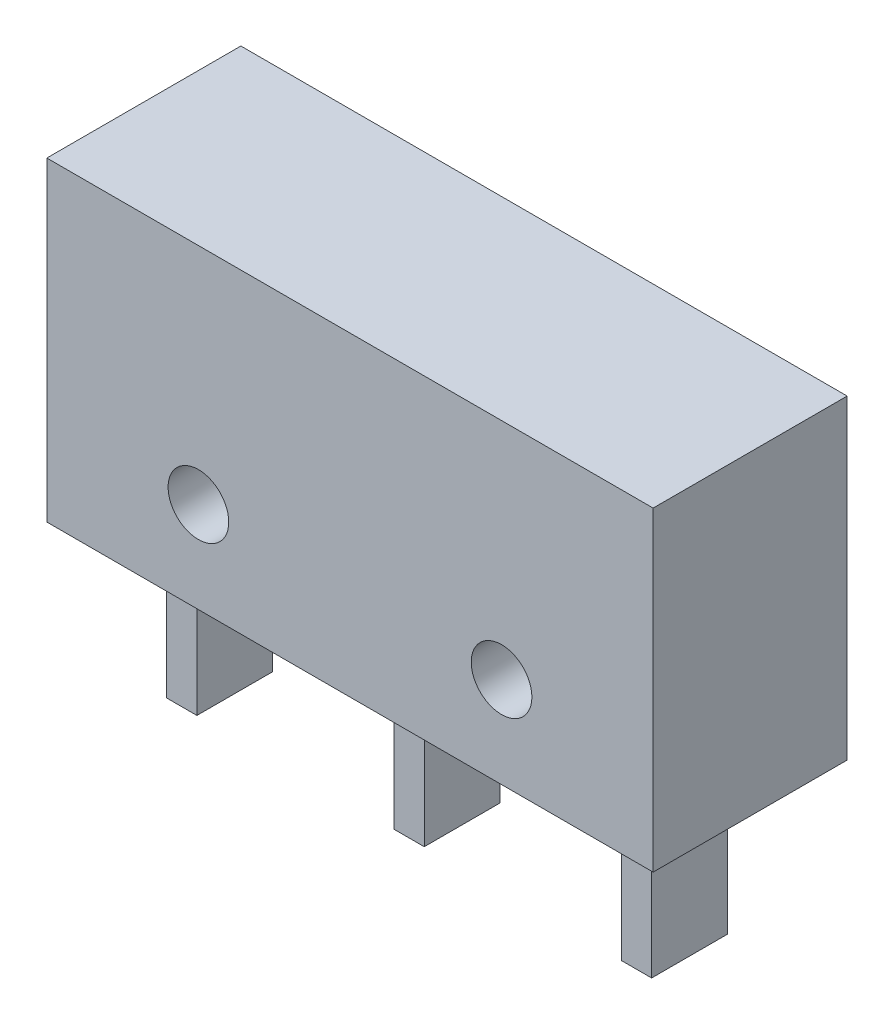
ISO-10303-21;
HEADER;
FILE_DESCRIPTION(('STEP AP214'),'2;1');
FILE_NAME('part.step','',(''),(''),'','','');
FILE_SCHEMA(('AUTOMOTIVE_DESIGN { 1 0 10303 214 1 1 1 1 }'));
ENDSEC;
DATA;
#1=APPLICATION_CONTEXT('core data for automotive mechanical design processes');
#2=APPLICATION_PROTOCOL_DEFINITION('international standard','automotive_design',2000,#1);
#3=PRODUCT_CONTEXT('',#1,'mechanical');
#4=PRODUCT('Part','Part','',(#3));
#5=PRODUCT_RELATED_PRODUCT_CATEGORY('part','',(#4));
#6=PRODUCT_DEFINITION_FORMATION('','',#4);
#7=PRODUCT_DEFINITION_CONTEXT('part definition',#1,'design');
#8=PRODUCT_DEFINITION('design','',#6,#7);
#9=PRODUCT_DEFINITION_SHAPE('','',#8);
#10=(LENGTH_UNIT() NAMED_UNIT(*) SI_UNIT(.MILLI.,.METRE.));
#11=(NAMED_UNIT(*) PLANE_ANGLE_UNIT() SI_UNIT($,.RADIAN.));
#12=(NAMED_UNIT(*) SI_UNIT($,.STERADIAN.) SOLID_ANGLE_UNIT());
#13=UNCERTAINTY_MEASURE_WITH_UNIT(LENGTH_MEASURE(1.E-05),#10,'distance_accuracy_value','');
#14=(GEOMETRIC_REPRESENTATION_CONTEXT(3) GLOBAL_UNCERTAINTY_ASSIGNED_CONTEXT((#13)) GLOBAL_UNIT_ASSIGNED_CONTEXT((#10,
#11,#12)) REPRESENTATION_CONTEXT('',''));
#15=CARTESIAN_POINT('',(0.,0.,0.));
#16=DIRECTION('',(0.,0.,1.));
#17=DIRECTION('',(1.,0.,0.));
#18=AXIS2_PLACEMENT_3D('',#15,#16,#17);
#19=CARTESIAN_POINT('',(-10.,-5.2,6.4));
#20=DIRECTION('',(0.,1.,0.));
#21=DIRECTION('',(0.,0.,1.));
#22=AXIS2_PLACEMENT_3D('',#19,#20,#21);
#23=PLANE('',#22);
#24=DIRECTION('',(0.,0.,1.));
#25=VECTOR('',#24,1.);
#26=CARTESIAN_POINT('',(0.499999999999996,-5.2,4.45));
#27=LINE('',#26,#25);
#28=CARTESIAN_POINT('',(0.499999999999996,-5.2,1.95));
#29=VERTEX_POINT('',#28);
#30=CARTESIAN_POINT('',(0.499999999999997,-5.2,4.45));
#31=VERTEX_POINT('',#30);
#32=EDGE_CURVE('E167',#29,#31,#27,.T.);
#33=ORIENTED_EDGE('',*,*,#32,.F.);
#34=DIRECTION('',(1.,0.,0.));
#35=VECTOR('',#34,1.);
#36=CARTESIAN_POINT('',(-0.500000000000004,-5.2,1.95));
#37=LINE('',#36,#35);
#38=CARTESIAN_POINT('',(-0.500000000000004,-5.2,1.95));
#39=VERTEX_POINT('',#38);
#40=EDGE_CURVE('E180',#39,#29,#37,.T.);
#41=ORIENTED_EDGE('',*,*,#40,.F.);
#42=DIRECTION('',(0.,0.,-1.));
#43=VECTOR('',#42,1.);
#44=CARTESIAN_POINT('',(-0.500000000000004,-5.2,4.45));
#45=LINE('',#44,#43);
#46=CARTESIAN_POINT('',(-0.500000000000004,-5.2,4.45));
#47=VERTEX_POINT('',#46);
#48=EDGE_CURVE('E189',#47,#39,#45,.T.);
#49=ORIENTED_EDGE('',*,*,#48,.F.);
#50=DIRECTION('',(-1.,0.,0.));
#51=VECTOR('',#50,1.);
#52=CARTESIAN_POINT('',(-0.500000000000004,-5.2,4.45));
#53=LINE('',#52,#51);
#54=EDGE_CURVE('E170',#31,#47,#53,.T.);
#55=ORIENTED_EDGE('',*,*,#54,.F.);
#56=EDGE_LOOP('',(#33,#41,#49,#55));
#57=FACE_BOUND('',#56,.T.);
#58=DIRECTION('',(1.,0.,0.));
#59=VECTOR('',#58,1.);
#60=CARTESIAN_POINT('',(-10.,-5.2,0.));
#61=LINE('',#60,#59);
#62=CARTESIAN_POINT('',(-10.,-5.2,0.));
#63=VERTEX_POINT('',#62);
#64=CARTESIAN_POINT('',(10.,-5.2,0.));
#65=VERTEX_POINT('',#64);
#66=EDGE_CURVE('E255',#63,#65,#61,.T.);
#67=ORIENTED_EDGE('',*,*,#66,.T.);
#68=DIRECTION('',(0.,0.,-1.));
#69=VECTOR('',#68,1.);
#70=CARTESIAN_POINT('',(10.,-5.2,6.4));
#71=LINE('',#70,#69);
#72=CARTESIAN_POINT('',(10.,-5.2,6.4));
#73=VERTEX_POINT('',#72);
#74=EDGE_CURVE('E261',#73,#65,#71,.T.);
#75=ORIENTED_EDGE('',*,*,#74,.F.);
#76=DIRECTION('',(1.,0.,0.));
#77=VECTOR('',#76,1.);
#78=CARTESIAN_POINT('',(-10.,-5.2,6.4));
#79=LINE('',#78,#77);
#80=CARTESIAN_POINT('',(-10.,-5.2,6.4));
#81=VERTEX_POINT('',#80);
#82=EDGE_CURVE('E259',#81,#73,#79,.T.);
#83=ORIENTED_EDGE('',*,*,#82,.F.);
#84=DIRECTION('',(0.,0.,-1.));
#85=VECTOR('',#84,1.);
#86=CARTESIAN_POINT('',(-10.,-5.2,6.4));
#87=LINE('',#86,#85);
#88=EDGE_CURVE('E271',#81,#63,#87,.T.);
#89=ORIENTED_EDGE('',*,*,#88,.T.);
#90=EDGE_LOOP('',(#67,#75,#83,#89));
#91=FACE_BOUND('',#90,.T.);
#92=DIRECTION('',(0.,0.,1.));
#93=VECTOR('',#92,1.);
#94=CARTESIAN_POINT('',(-7.,-5.2,4.45));
#95=LINE('',#94,#93);
#96=CARTESIAN_POINT('',(-7.,-5.2,1.95));
#97=VERTEX_POINT('',#96);
#98=CARTESIAN_POINT('',(-7.,-5.2,4.45));
#99=VERTEX_POINT('',#98);
#100=EDGE_CURVE('E205',#97,#99,#95,.T.);
#101=ORIENTED_EDGE('',*,*,#100,.F.);
#102=DIRECTION('',(1.,0.,0.));
#103=VECTOR('',#102,1.);
#104=CARTESIAN_POINT('',(-8.00000000000001,-5.2,1.95));
#105=LINE('',#104,#103);
#106=CARTESIAN_POINT('',(-8.00000000000001,-5.2,1.95));
#107=VERTEX_POINT('',#106);
#108=EDGE_CURVE('E210',#107,#97,#105,.T.);
#109=ORIENTED_EDGE('',*,*,#108,.F.);
#110=DIRECTION('',(0.,0.,-1.));
#111=VECTOR('',#110,1.);
#112=CARTESIAN_POINT('',(-8.00000000000001,-5.2,4.45));
#113=LINE('',#112,#111);
#114=CARTESIAN_POINT('',(-8.00000000000001,-5.2,4.45));
#115=VERTEX_POINT('',#114);
#116=EDGE_CURVE('E222',#115,#107,#113,.T.);
#117=ORIENTED_EDGE('',*,*,#116,.F.);
#118=DIRECTION('',(-1.,0.,0.));
#119=VECTOR('',#118,1.);
#120=CARTESIAN_POINT('',(-8.00000000000001,-5.2,4.45));
#121=LINE('',#120,#119);
#122=EDGE_CURVE('E219',#99,#115,#121,.T.);
#123=ORIENTED_EDGE('',*,*,#122,.F.);
#124=EDGE_LOOP('',(#101,#109,#117,#123));
#125=FACE_BOUND('',#124,.T.);
#126=DIRECTION('',(0.,0.,1.));
#127=VECTOR('',#126,1.);
#128=CARTESIAN_POINT('',(8.,-5.2,4.45));
#129=LINE('',#128,#127);
#130=CARTESIAN_POINT('',(8.,-5.2,1.95));
#131=VERTEX_POINT('',#130);
#132=CARTESIAN_POINT('',(8.,-5.2,4.45));
#133=VERTEX_POINT('',#132);
#134=EDGE_CURVE('E166',#131,#133,#129,.T.);
#135=ORIENTED_EDGE('',*,*,#134,.F.);
#136=DIRECTION('',(1.,0.,0.));
#137=VECTOR('',#136,1.);
#138=CARTESIAN_POINT('',(7.,-5.2,1.95));
#139=LINE('',#138,#137);
#140=CARTESIAN_POINT('',(7.,-5.2,1.95));
#141=VERTEX_POINT('',#140);
#142=EDGE_CURVE('E163',#141,#131,#139,.T.);
#143=ORIENTED_EDGE('',*,*,#142,.F.);
#144=DIRECTION('',(0.,0.,-1.));
#145=VECTOR('',#144,1.);
#146=CARTESIAN_POINT('',(7.,-5.2,4.45));
#147=LINE('',#146,#145);
#148=CARTESIAN_POINT('',(7.,-5.2,4.45));
#149=VERTEX_POINT('',#148);
#150=EDGE_CURVE('E53',#149,#141,#147,.T.);
#151=ORIENTED_EDGE('',*,*,#150,.F.);
#152=DIRECTION('',(-1.,0.,0.));
#153=VECTOR('',#152,1.);
#154=CARTESIAN_POINT('',(7.,-5.2,4.45));
#155=LINE('',#154,#153);
#156=EDGE_CURVE('E48',#133,#149,#155,.T.);
#157=ORIENTED_EDGE('',*,*,#156,.F.);
#158=EDGE_LOOP('',(#135,#143,#151,#157));
#159=FACE_BOUND('',#158,.T.);
#160=ADVANCED_FACE('F33',(#57,#91,#125,#159),#23,.F.);
#161=CARTESIAN_POINT('',(0.,0.,6.4));
#162=DIRECTION('',(0.,0.,-1.));
#163=DIRECTION('',(-1.,0.,0.));
#164=AXIS2_PLACEMENT_3D('',#161,#162,#163);
#165=PLANE('',#164);
#166=CARTESIAN_POINT('',(-5.,-2.2,6.4));
#167=DIRECTION('',(0.,0.,1.));
#168=DIRECTION('',(1.,0.,0.));
#169=AXIS2_PLACEMENT_3D('',#166,#167,#168);
#170=CIRCLE('',#169,1.);
#171=CARTESIAN_POINT('',(-4.,-2.2,6.4));
#172=VERTEX_POINT('',#171);
#173=EDGE_CURVE('E245',#172,#172,#170,.T.);
#174=ORIENTED_EDGE('',*,*,#173,.F.);
#175=EDGE_LOOP('',(#174));
#176=FACE_BOUND('',#175,.T.);
#177=DIRECTION('',(0.,1.,0.));
#178=VECTOR('',#177,1.);
#179=CARTESIAN_POINT('',(10.,-5.2,6.4));
#180=LINE('',#179,#178);
#181=CARTESIAN_POINT('',(10.,5.2,6.4));
#182=VERTEX_POINT('',#181);
#183=EDGE_CURVE('E251',#73,#182,#180,.T.);
#184=ORIENTED_EDGE('',*,*,#183,.T.);
#185=DIRECTION('',(-1.,0.,0.));
#186=VECTOR('',#185,1.);
#187=CARTESIAN_POINT('',(-10.,5.2,6.4));
#188=LINE('',#187,#186);
#189=CARTESIAN_POINT('',(-10.,5.2,6.4));
#190=VERTEX_POINT('',#189);
#191=EDGE_CURVE('E254',#182,#190,#188,.T.);
#192=ORIENTED_EDGE('',*,*,#191,.T.);
#193=DIRECTION('',(0.,-1.,0.));
#194=VECTOR('',#193,1.);
#195=CARTESIAN_POINT('',(-10.,-5.2,6.4));
#196=LINE('',#195,#194);
#197=EDGE_CURVE('E257',#190,#81,#196,.T.);
#198=ORIENTED_EDGE('',*,*,#197,.T.);
#199=ORIENTED_EDGE('',*,*,#82,.T.);
#200=EDGE_LOOP('',(#184,#192,#198,#199));
#201=FACE_BOUND('',#200,.T.);
#202=CARTESIAN_POINT('',(5.,-2.2,6.4));
#203=DIRECTION('',(0.,0.,1.));
#204=DIRECTION('',(1.,0.,0.));
#205=AXIS2_PLACEMENT_3D('',#202,#203,#204);
#206=CIRCLE('',#205,1.);
#207=CARTESIAN_POINT('',(6.,-2.2,6.4));
#208=VERTEX_POINT('',#207);
#209=EDGE_CURVE('E239',#208,#208,#206,.T.);
#210=ORIENTED_EDGE('',*,*,#209,.F.);
#211=EDGE_LOOP('',(#210));
#212=FACE_BOUND('',#211,.T.);
#213=ADVANCED_FACE('F294',(#176,#201,#212),#165,.F.);
#214=CARTESIAN_POINT('',(0.,0.,0.));
#215=DIRECTION('',(0.,0.,-1.));
#216=DIRECTION('',(-1.,0.,0.));
#217=AXIS2_PLACEMENT_3D('',#214,#215,#216);
#218=PLANE('',#217);
#219=CARTESIAN_POINT('',(-5.,-2.2,0.));
#220=DIRECTION('',(0.,0.,1.));
#221=DIRECTION('',(1.,0.,0.));
#222=AXIS2_PLACEMENT_3D('',#219,#220,#221);
#223=CIRCLE('',#222,1.);
#224=CARTESIAN_POINT('',(-4.,-2.2,0.));
#225=VERTEX_POINT('',#224);
#226=EDGE_CURVE('E242',#225,#225,#223,.T.);
#227=ORIENTED_EDGE('',*,*,#226,.T.);
#228=EDGE_LOOP('',(#227));
#229=FACE_BOUND('',#228,.T.);
#230=DIRECTION('',(0.,1.,0.));
#231=VECTOR('',#230,1.);
#232=CARTESIAN_POINT('',(10.,-5.2,0.));
#233=LINE('',#232,#231);
#234=CARTESIAN_POINT('',(10.,5.2,0.));
#235=VERTEX_POINT('',#234);
#236=EDGE_CURVE('E248',#65,#235,#233,.T.);
#237=ORIENTED_EDGE('',*,*,#236,.F.);
#238=ORIENTED_EDGE('',*,*,#66,.F.);
#239=DIRECTION('',(0.,-1.,0.));
#240=VECTOR('',#239,1.);
#241=CARTESIAN_POINT('',(-10.,-5.2,0.));
#242=LINE('',#241,#240);
#243=CARTESIAN_POINT('',(-10.,5.2,0.));
#244=VERTEX_POINT('',#243);
#245=EDGE_CURVE('E266',#244,#63,#242,.T.);
#246=ORIENTED_EDGE('',*,*,#245,.F.);
#247=DIRECTION('',(-1.,0.,0.));
#248=VECTOR('',#247,1.);
#249=CARTESIAN_POINT('',(-10.,5.2,0.));
#250=LINE('',#249,#248);
#251=EDGE_CURVE('E264',#235,#244,#250,.T.);
#252=ORIENTED_EDGE('',*,*,#251,.F.);
#253=EDGE_LOOP('',(#237,#238,#246,#252));
#254=FACE_BOUND('',#253,.T.);
#255=CARTESIAN_POINT('',(5.,-2.2,0.));
#256=DIRECTION('',(0.,0.,1.));
#257=DIRECTION('',(1.,0.,0.));
#258=AXIS2_PLACEMENT_3D('',#255,#256,#257);
#259=CIRCLE('',#258,1.);
#260=CARTESIAN_POINT('',(6.,-2.2,0.));
#261=VERTEX_POINT('',#260);
#262=EDGE_CURVE('E238',#261,#261,#259,.T.);
#263=ORIENTED_EDGE('',*,*,#262,.T.);
#264=EDGE_LOOP('',(#263));
#265=FACE_BOUND('',#264,.T.);
#266=ADVANCED_FACE('F284',(#229,#254,#265),#218,.T.);
#267=CARTESIAN_POINT('',(10.,-5.2,6.4));
#268=DIRECTION('',(-1.,0.,0.));
#269=DIRECTION('',(0.,0.,1.));
#270=AXIS2_PLACEMENT_3D('',#267,#268,#269);
#271=PLANE('',#270);
#272=ORIENTED_EDGE('',*,*,#236,.T.);
#273=DIRECTION('',(0.,0.,-1.));
#274=VECTOR('',#273,1.);
#275=CARTESIAN_POINT('',(10.,5.2,6.4));
#276=LINE('',#275,#274);
#277=EDGE_CURVE('E11',#182,#235,#276,.T.);
#278=ORIENTED_EDGE('',*,*,#277,.F.);
#279=ORIENTED_EDGE('',*,*,#183,.F.);
#280=ORIENTED_EDGE('',*,*,#74,.T.);
#281=EDGE_LOOP('',(#272,#278,#279,#280));
#282=FACE_BOUND('',#281,.T.);
#283=ADVANCED_FACE('F35',(#282),#271,.F.);
#284=CARTESIAN_POINT('',(-10.,5.2,6.4));
#285=DIRECTION('',(0.,-1.,0.));
#286=DIRECTION('',(0.,0.,-1.));
#287=AXIS2_PLACEMENT_3D('',#284,#285,#286);
#288=PLANE('',#287);
#289=ORIENTED_EDGE('',*,*,#251,.T.);
#290=DIRECTION('',(0.,0.,-1.));
#291=VECTOR('',#290,1.);
#292=CARTESIAN_POINT('',(-10.,5.2,6.4));
#293=LINE('',#292,#291);
#294=EDGE_CURVE('E41',#190,#244,#293,.T.);
#295=ORIENTED_EDGE('',*,*,#294,.F.);
#296=ORIENTED_EDGE('',*,*,#191,.F.);
#297=ORIENTED_EDGE('',*,*,#277,.T.);
#298=EDGE_LOOP('',(#289,#295,#296,#297));
#299=FACE_BOUND('',#298,.T.);
#300=ADVANCED_FACE('F296',(#299),#288,.F.);
#301=CARTESIAN_POINT('',(-10.,-5.2,6.4));
#302=DIRECTION('',(1.,0.,0.));
#303=DIRECTION('',(0.,0.,-1.));
#304=AXIS2_PLACEMENT_3D('',#301,#302,#303);
#305=PLANE('',#304);
#306=ORIENTED_EDGE('',*,*,#245,.T.);
#307=ORIENTED_EDGE('',*,*,#88,.F.);
#308=ORIENTED_EDGE('',*,*,#197,.F.);
#309=ORIENTED_EDGE('',*,*,#294,.T.);
#310=EDGE_LOOP('',(#306,#307,#308,#309));
#311=FACE_BOUND('',#310,.T.);
#312=ADVANCED_FACE('F278',(#311),#305,.F.);
#313=CARTESIAN_POINT('',(-5.,-2.2,6.4));
#314=DIRECTION('',(0.,0.,-1.));
#315=DIRECTION('',(-1.,0.,0.));
#316=AXIS2_PLACEMENT_3D('',#313,#314,#315);
#317=CYLINDRICAL_SURFACE('',#316,1.);
#318=ORIENTED_EDGE('',*,*,#173,.T.);
#319=EDGE_LOOP('',(#318));
#320=FACE_BOUND('',#319,.T.);
#321=ORIENTED_EDGE('',*,*,#226,.F.);
#322=EDGE_LOOP('',(#321));
#323=FACE_BOUND('',#322,.T.);
#324=ADVANCED_FACE('F302',(#320,#323),#317,.F.);
#325=CARTESIAN_POINT('',(5.,-2.2,6.4));
#326=DIRECTION('',(0.,0.,-1.));
#327=DIRECTION('',(-1.,0.,0.));
#328=AXIS2_PLACEMENT_3D('',#325,#326,#327);
#329=CYLINDRICAL_SURFACE('',#328,1.);
#330=ORIENTED_EDGE('',*,*,#209,.T.);
#331=EDGE_LOOP('',(#330));
#332=FACE_BOUND('',#331,.T.);
#333=ORIENTED_EDGE('',*,*,#262,.F.);
#334=EDGE_LOOP('',(#333));
#335=FACE_BOUND('',#334,.T.);
#336=ADVANCED_FACE('F318',(#332,#335),#329,.F.);
#337=CARTESIAN_POINT('',(-7.,-10.2,4.45));
#338=DIRECTION('',(-1.,0.,0.));
#339=DIRECTION('',(0.,0.,1.));
#340=AXIS2_PLACEMENT_3D('',#337,#338,#339);
#341=PLANE('',#340);
#342=ORIENTED_EDGE('',*,*,#100,.T.);
#343=DIRECTION('',(0.,1.,0.));
#344=VECTOR('',#343,1.);
#345=CARTESIAN_POINT('',(-7.,-10.2,4.45));
#346=LINE('',#345,#344);
#347=CARTESIAN_POINT('',(-7.,-10.2,4.45));
#348=VERTEX_POINT('',#347);
#349=EDGE_CURVE('E235',#348,#99,#346,.T.);
#350=ORIENTED_EDGE('',*,*,#349,.F.);
#351=DIRECTION('',(0.,0.,1.));
#352=VECTOR('',#351,1.);
#353=CARTESIAN_POINT('',(-7.,-10.2,4.45));
#354=LINE('',#353,#352);
#355=CARTESIAN_POINT('',(-7.,-10.2,1.95));
#356=VERTEX_POINT('',#355);
#357=EDGE_CURVE('E206',#356,#348,#354,.T.);
#358=ORIENTED_EDGE('',*,*,#357,.F.);
#359=DIRECTION('',(0.,1.,0.));
#360=VECTOR('',#359,1.);
#361=CARTESIAN_POINT('',(-7.,-10.2,1.95));
#362=LINE('',#361,#360);
#363=EDGE_CURVE('E216',#356,#97,#362,.T.);
#364=ORIENTED_EDGE('',*,*,#363,.T.);
#365=EDGE_LOOP('',(#342,#350,#358,#364));
#366=FACE_BOUND('',#365,.T.);
#367=ADVANCED_FACE('F322',(#366),#341,.F.);
#368=CARTESIAN_POINT('',(-8.00000000000001,-10.2,4.45));
#369=DIRECTION('',(0.,0.,-1.));
#370=DIRECTION('',(-1.,0.,0.));
#371=AXIS2_PLACEMENT_3D('',#368,#369,#370);
#372=PLANE('',#371);
#373=ORIENTED_EDGE('',*,*,#122,.T.);
#374=DIRECTION('',(0.,1.,0.));
#375=VECTOR('',#374,1.);
#376=CARTESIAN_POINT('',(-8.00000000000001,-10.2,4.45));
#377=LINE('',#376,#375);
#378=CARTESIAN_POINT('',(-8.00000000000001,-10.2,4.45));
#379=VERTEX_POINT('',#378);
#380=EDGE_CURVE('E232',#379,#115,#377,.T.);
#381=ORIENTED_EDGE('',*,*,#380,.F.);
#382=DIRECTION('',(-1.,0.,0.));
#383=VECTOR('',#382,1.);
#384=CARTESIAN_POINT('',(-8.00000000000001,-10.2,4.45));
#385=LINE('',#384,#383);
#386=EDGE_CURVE('E209',#348,#379,#385,.T.);
#387=ORIENTED_EDGE('',*,*,#386,.F.);
#388=ORIENTED_EDGE('',*,*,#349,.T.);
#389=EDGE_LOOP('',(#373,#381,#387,#388));
#390=FACE_BOUND('',#389,.T.);
#391=ADVANCED_FACE('F326',(#390),#372,.F.);
#392=CARTESIAN_POINT('',(-8.00000000000001,-10.2,4.45));
#393=DIRECTION('',(1.,0.,0.));
#394=DIRECTION('',(0.,0.,-1.));
#395=AXIS2_PLACEMENT_3D('',#392,#393,#394);
#396=PLANE('',#395);
#397=ORIENTED_EDGE('',*,*,#116,.T.);
#398=DIRECTION('',(0.,1.,0.));
#399=VECTOR('',#398,1.);
#400=CARTESIAN_POINT('',(-8.00000000000001,-10.2,1.95));
#401=LINE('',#400,#399);
#402=CARTESIAN_POINT('',(-8.00000000000001,-10.2,1.95));
#403=VERTEX_POINT('',#402);
#404=EDGE_CURVE('E229',#403,#107,#401,.T.);
#405=ORIENTED_EDGE('',*,*,#404,.F.);
#406=DIRECTION('',(0.,0.,-1.));
#407=VECTOR('',#406,1.);
#408=CARTESIAN_POINT('',(-8.00000000000001,-10.2,4.45));
#409=LINE('',#408,#407);
#410=EDGE_CURVE('E212',#379,#403,#409,.T.);
#411=ORIENTED_EDGE('',*,*,#410,.F.);
#412=ORIENTED_EDGE('',*,*,#380,.T.);
#413=EDGE_LOOP('',(#397,#405,#411,#412));
#414=FACE_BOUND('',#413,.T.);
#415=ADVANCED_FACE('F330',(#414),#396,.F.);
#416=CARTESIAN_POINT('',(-8.00000000000001,-10.2,1.95));
#417=DIRECTION('',(0.,0.,1.));
#418=DIRECTION('',(1.,0.,0.));
#419=AXIS2_PLACEMENT_3D('',#416,#417,#418);
#420=PLANE('',#419);
#421=ORIENTED_EDGE('',*,*,#108,.T.);
#422=ORIENTED_EDGE('',*,*,#363,.F.);
#423=DIRECTION('',(1.,0.,0.));
#424=VECTOR('',#423,1.);
#425=CARTESIAN_POINT('',(-8.00000000000001,-10.2,1.95));
#426=LINE('',#425,#424);
#427=EDGE_CURVE('E214',#403,#356,#426,.T.);
#428=ORIENTED_EDGE('',*,*,#427,.F.);
#429=ORIENTED_EDGE('',*,*,#404,.T.);
#430=EDGE_LOOP('',(#421,#422,#428,#429));
#431=FACE_BOUND('',#430,.T.);
#432=ADVANCED_FACE('F334',(#431),#420,.F.);
#433=CARTESIAN_POINT('',(0.,-10.2,0.));
#434=DIRECTION('',(0.,-1.,0.));
#435=DIRECTION('',(0.,0.,-1.));
#436=AXIS2_PLACEMENT_3D('',#433,#434,#435);
#437=PLANE('',#436);
#438=ORIENTED_EDGE('',*,*,#357,.T.);
#439=ORIENTED_EDGE('',*,*,#386,.T.);
#440=ORIENTED_EDGE('',*,*,#410,.T.);
#441=ORIENTED_EDGE('',*,*,#427,.T.);
#442=EDGE_LOOP('',(#438,#439,#440,#441));
#443=FACE_BOUND('',#442,.T.);
#444=ADVANCED_FACE('F338',(#443),#437,.T.);
#445=CARTESIAN_POINT('',(0.499999999999996,-10.2,4.45));
#446=DIRECTION('',(-1.,0.,0.));
#447=DIRECTION('',(0.,0.,1.));
#448=AXIS2_PLACEMENT_3D('',#445,#446,#447);
#449=PLANE('',#448);
#450=ORIENTED_EDGE('',*,*,#32,.T.);
#451=DIRECTION('',(0.,1.,0.));
#452=VECTOR('',#451,1.);
#453=CARTESIAN_POINT('',(0.499999999999996,-10.2,4.45));
#454=LINE('',#453,#452);
#455=CARTESIAN_POINT('',(0.499999999999996,-10.2,4.45));
#456=VERTEX_POINT('',#455);
#457=EDGE_CURVE('E202',#456,#31,#454,.T.);
#458=ORIENTED_EDGE('',*,*,#457,.F.);
#459=DIRECTION('',(0.,0.,1.));
#460=VECTOR('',#459,1.);
#461=CARTESIAN_POINT('',(0.499999999999996,-10.2,4.45));
#462=LINE('',#461,#460);
#463=CARTESIAN_POINT('',(0.499999999999996,-10.2,1.95));
#464=VERTEX_POINT('',#463);
#465=EDGE_CURVE('E176',#464,#456,#462,.T.);
#466=ORIENTED_EDGE('',*,*,#465,.F.);
#467=DIRECTION('',(0.,1.,0.));
#468=VECTOR('',#467,1.);
#469=CARTESIAN_POINT('',(0.499999999999996,-10.2,1.95));
#470=LINE('',#469,#468);
#471=EDGE_CURVE('E185',#464,#29,#470,.T.);
#472=ORIENTED_EDGE('',*,*,#471,.T.);
#473=EDGE_LOOP('',(#450,#458,#466,#472));
#474=FACE_BOUND('',#473,.T.);
#475=ADVANCED_FACE('F342',(#474),#449,.F.);
#476=CARTESIAN_POINT('',(-0.500000000000004,-10.2,4.45));
#477=DIRECTION('',(0.,0.,-1.));
#478=DIRECTION('',(-1.,0.,0.));
#479=AXIS2_PLACEMENT_3D('',#476,#477,#478);
#480=PLANE('',#479);
#481=ORIENTED_EDGE('',*,*,#54,.T.);
#482=DIRECTION('',(0.,1.,0.));
#483=VECTOR('',#482,1.);
#484=CARTESIAN_POINT('',(-0.500000000000004,-10.2,4.45));
#485=LINE('',#484,#483);
#486=CARTESIAN_POINT('',(-0.500000000000004,-10.2,4.45));
#487=VERTEX_POINT('',#486);
#488=EDGE_CURVE('E199',#487,#47,#485,.T.);
#489=ORIENTED_EDGE('',*,*,#488,.F.);
#490=DIRECTION('',(-1.,0.,0.));
#491=VECTOR('',#490,1.);
#492=CARTESIAN_POINT('',(-0.500000000000004,-10.2,4.45));
#493=LINE('',#492,#491);
#494=EDGE_CURVE('E179',#456,#487,#493,.T.);
#495=ORIENTED_EDGE('',*,*,#494,.F.);
#496=ORIENTED_EDGE('',*,*,#457,.T.);
#497=EDGE_LOOP('',(#481,#489,#495,#496));
#498=FACE_BOUND('',#497,.T.);
#499=ADVANCED_FACE('F346',(#498),#480,.F.);
#500=CARTESIAN_POINT('',(-0.500000000000004,-10.2,4.45));
#501=DIRECTION('',(1.,0.,0.));
#502=DIRECTION('',(0.,0.,-1.));
#503=AXIS2_PLACEMENT_3D('',#500,#501,#502);
#504=PLANE('',#503);
#505=ORIENTED_EDGE('',*,*,#48,.T.);
#506=DIRECTION('',(0.,1.,0.));
#507=VECTOR('',#506,1.);
#508=CARTESIAN_POINT('',(-0.500000000000004,-10.2,1.95));
#509=LINE('',#508,#507);
#510=CARTESIAN_POINT('',(-0.500000000000004,-10.2,1.95));
#511=VERTEX_POINT('',#510);
#512=EDGE_CURVE('E196',#511,#39,#509,.T.);
#513=ORIENTED_EDGE('',*,*,#512,.F.);
#514=DIRECTION('',(0.,0.,-1.));
#515=VECTOR('',#514,1.);
#516=CARTESIAN_POINT('',(-0.500000000000004,-10.2,4.45));
#517=LINE('',#516,#515);
#518=EDGE_CURVE('E182',#487,#511,#517,.T.);
#519=ORIENTED_EDGE('',*,*,#518,.F.);
#520=ORIENTED_EDGE('',*,*,#488,.T.);
#521=EDGE_LOOP('',(#505,#513,#519,#520));
#522=FACE_BOUND('',#521,.T.);
#523=ADVANCED_FACE('F350',(#522),#504,.F.);
#524=CARTESIAN_POINT('',(-0.500000000000004,-10.2,1.95));
#525=DIRECTION('',(0.,0.,1.));
#526=DIRECTION('',(1.,0.,0.));
#527=AXIS2_PLACEMENT_3D('',#524,#525,#526);
#528=PLANE('',#527);
#529=ORIENTED_EDGE('',*,*,#40,.T.);
#530=ORIENTED_EDGE('',*,*,#471,.F.);
#531=DIRECTION('',(1.,0.,0.));
#532=VECTOR('',#531,1.);
#533=CARTESIAN_POINT('',(-0.500000000000004,-10.2,1.95));
#534=LINE('',#533,#532);
#535=EDGE_CURVE('E184',#511,#464,#534,.T.);
#536=ORIENTED_EDGE('',*,*,#535,.F.);
#537=ORIENTED_EDGE('',*,*,#512,.T.);
#538=EDGE_LOOP('',(#529,#530,#536,#537));
#539=FACE_BOUND('',#538,.T.);
#540=ADVANCED_FACE('F354',(#539),#528,.F.);
#541=CARTESIAN_POINT('',(0.,-10.2,0.));
#542=DIRECTION('',(0.,-1.,0.));
#543=DIRECTION('',(0.,0.,-1.));
#544=AXIS2_PLACEMENT_3D('',#541,#542,#543);
#545=PLANE('',#544);
#546=ORIENTED_EDGE('',*,*,#465,.T.);
#547=ORIENTED_EDGE('',*,*,#494,.T.);
#548=ORIENTED_EDGE('',*,*,#518,.T.);
#549=ORIENTED_EDGE('',*,*,#535,.T.);
#550=EDGE_LOOP('',(#546,#547,#548,#549));
#551=FACE_BOUND('',#550,.T.);
#552=ADVANCED_FACE('F358',(#551),#545,.T.);
#553=CARTESIAN_POINT('',(8.,-10.2,4.45));
#554=DIRECTION('',(-1.,0.,0.));
#555=DIRECTION('',(0.,0.,1.));
#556=AXIS2_PLACEMENT_3D('',#553,#554,#555);
#557=PLANE('',#556);
#558=ORIENTED_EDGE('',*,*,#134,.T.);
#559=DIRECTION('',(0.,1.,0.));
#560=VECTOR('',#559,1.);
#561=CARTESIAN_POINT('',(8.,-10.2,4.45));
#562=LINE('',#561,#560);
#563=CARTESIAN_POINT('',(8.,-10.2,4.45));
#564=VERTEX_POINT('',#563);
#565=EDGE_CURVE('E147',#564,#133,#562,.T.);
#566=ORIENTED_EDGE('',*,*,#565,.F.);
#567=DIRECTION('',(0.,0.,1.));
#568=VECTOR('',#567,1.);
#569=CARTESIAN_POINT('',(8.,-10.2,4.45));
#570=LINE('',#569,#568);
#571=CARTESIAN_POINT('',(8.,-10.2,1.95));
#572=VERTEX_POINT('',#571);
#573=EDGE_CURVE('E154',#572,#564,#570,.T.);
#574=ORIENTED_EDGE('',*,*,#573,.F.);
#575=DIRECTION('',(0.,1.,0.));
#576=VECTOR('',#575,1.);
#577=CARTESIAN_POINT('',(8.,-10.2,1.95));
#578=LINE('',#577,#576);
#579=EDGE_CURVE('E512',#572,#131,#578,.T.);
#580=ORIENTED_EDGE('',*,*,#579,.T.);
#581=EDGE_LOOP('',(#558,#566,#574,#580));
#582=FACE_BOUND('',#581,.T.);
#583=ADVANCED_FACE('F165',(#582),#557,.F.);
#584=CARTESIAN_POINT('',(7.,-10.2,4.45));
#585=DIRECTION('',(0.,0.,-1.));
#586=DIRECTION('',(-1.,0.,0.));
#587=AXIS2_PLACEMENT_3D('',#584,#585,#586);
#588=PLANE('',#587);
#589=ORIENTED_EDGE('',*,*,#156,.T.);
#590=DIRECTION('',(0.,1.,0.));
#591=VECTOR('',#590,1.);
#592=CARTESIAN_POINT('',(7.,-10.2,4.45));
#593=LINE('',#592,#591);
#594=CARTESIAN_POINT('',(7.,-10.2,4.45));
#595=VERTEX_POINT('',#594);
#596=EDGE_CURVE('E150',#595,#149,#593,.T.);
#597=ORIENTED_EDGE('',*,*,#596,.F.);
#598=DIRECTION('',(-1.,0.,0.));
#599=VECTOR('',#598,1.);
#600=CARTESIAN_POINT('',(7.,-10.2,4.45));
#601=LINE('',#600,#599);
#602=EDGE_CURVE('E143',#564,#595,#601,.T.);
#603=ORIENTED_EDGE('',*,*,#602,.F.);
#604=ORIENTED_EDGE('',*,*,#565,.T.);
#605=EDGE_LOOP('',(#589,#597,#603,#604));
#606=FACE_BOUND('',#605,.T.);
#607=ADVANCED_FACE('F145',(#606),#588,.F.);
#608=CARTESIAN_POINT('',(7.,-10.2,4.45));
#609=DIRECTION('',(1.,0.,0.));
#610=DIRECTION('',(0.,0.,-1.));
#611=AXIS2_PLACEMENT_3D('',#608,#609,#610);
#612=PLANE('',#611);
#613=ORIENTED_EDGE('',*,*,#150,.T.);
#614=DIRECTION('',(0.,1.,0.));
#615=VECTOR('',#614,1.);
#616=CARTESIAN_POINT('',(7.,-10.2,1.95));
#617=LINE('',#616,#615);
#618=CARTESIAN_POINT('',(7.,-10.2,1.95));
#619=VERTEX_POINT('',#618);
#620=EDGE_CURVE('E172',#619,#141,#617,.T.);
#621=ORIENTED_EDGE('',*,*,#620,.F.);
#622=DIRECTION('',(0.,0.,-1.));
#623=VECTOR('',#622,1.);
#624=CARTESIAN_POINT('',(7.,-10.2,4.45));
#625=LINE('',#624,#623);
#626=EDGE_CURVE('E153',#595,#619,#625,.T.);
#627=ORIENTED_EDGE('',*,*,#626,.F.);
#628=ORIENTED_EDGE('',*,*,#596,.T.);
#629=EDGE_LOOP('',(#613,#621,#627,#628));
#630=FACE_BOUND('',#629,.T.);
#631=ADVANCED_FACE('F367',(#630),#612,.F.);
#632=CARTESIAN_POINT('',(7.,-10.2,1.95));
#633=DIRECTION('',(0.,0.,1.));
#634=DIRECTION('',(1.,0.,0.));
#635=AXIS2_PLACEMENT_3D('',#632,#633,#634);
#636=PLANE('',#635);
#637=ORIENTED_EDGE('',*,*,#142,.T.);
#638=ORIENTED_EDGE('',*,*,#579,.F.);
#639=DIRECTION('',(1.,0.,0.));
#640=VECTOR('',#639,1.);
#641=CARTESIAN_POINT('',(7.,-10.2,1.95));
#642=LINE('',#641,#640);
#643=EDGE_CURVE('E159',#619,#572,#642,.T.);
#644=ORIENTED_EDGE('',*,*,#643,.F.);
#645=ORIENTED_EDGE('',*,*,#620,.T.);
#646=EDGE_LOOP('',(#637,#638,#644,#645));
#647=FACE_BOUND('',#646,.T.);
#648=ADVANCED_FACE('F370',(#647),#636,.F.);
#649=CARTESIAN_POINT('',(0.,-10.2,0.));
#650=DIRECTION('',(0.,-1.,0.));
#651=DIRECTION('',(0.,0.,-1.));
#652=AXIS2_PLACEMENT_3D('',#649,#650,#651);
#653=PLANE('',#652);
#654=ORIENTED_EDGE('',*,*,#573,.T.);
#655=ORIENTED_EDGE('',*,*,#602,.T.);
#656=ORIENTED_EDGE('',*,*,#626,.T.);
#657=ORIENTED_EDGE('',*,*,#643,.T.);
#658=EDGE_LOOP('',(#654,#655,#656,#657));
#659=FACE_BOUND('',#658,.T.);
#660=ADVANCED_FACE('F157',(#659),#653,.T.);
#661=CLOSED_SHELL('',(#160,#213,#266,#283,#300,#312,#324,#336,#367,#391,#415,#432,#444,#475,
#499,#523,#540,#552,#583,#607,#631,#648,#660));
#662=MANIFOLD_SOLID_BREP('B2',#661);
#663=ADVANCED_BREP_SHAPE_REPRESENTATION('',(#18,#662),#14);
#664=SHAPE_DEFINITION_REPRESENTATION(#9,#663);
ENDSEC;
END-ISO-10303-21;
